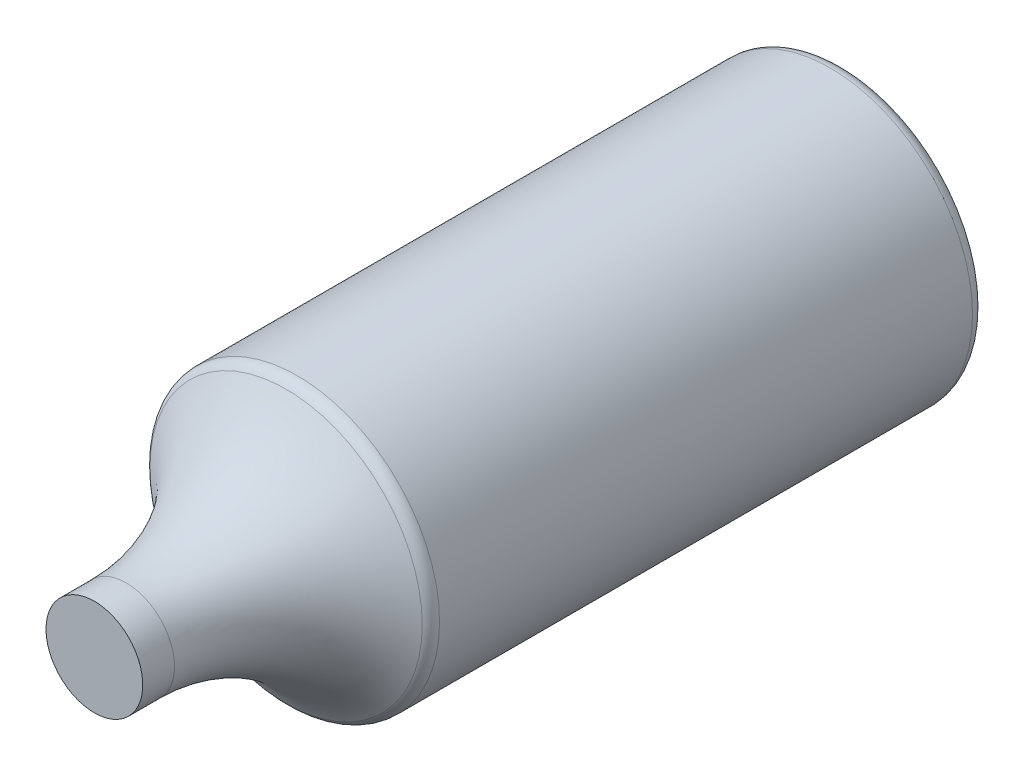
ISO-10303-21;
HEADER;
FILE_DESCRIPTION(('STEP AP214'),'2;1');
FILE_NAME('part.step','',(''),(''),'','','');
FILE_SCHEMA(('AUTOMOTIVE_DESIGN { 1 0 10303 214 1 1 1 1 }'));
ENDSEC;
DATA;
#1=APPLICATION_CONTEXT('core data for automotive mechanical design processes');
#2=APPLICATION_PROTOCOL_DEFINITION('international standard','automotive_design',2000,#1);
#3=PRODUCT_CONTEXT('',#1,'mechanical');
#4=PRODUCT('Part','Part','',(#3));
#5=PRODUCT_RELATED_PRODUCT_CATEGORY('part','',(#4));
#6=PRODUCT_DEFINITION_FORMATION('','',#4);
#7=PRODUCT_DEFINITION_CONTEXT('part definition',#1,'design');
#8=PRODUCT_DEFINITION('design','',#6,#7);
#9=PRODUCT_DEFINITION_SHAPE('','',#8);
#10=(LENGTH_UNIT() NAMED_UNIT(*) SI_UNIT(.MILLI.,.METRE.));
#11=(NAMED_UNIT(*) PLANE_ANGLE_UNIT() SI_UNIT($,.RADIAN.));
#12=(NAMED_UNIT(*) SI_UNIT($,.STERADIAN.) SOLID_ANGLE_UNIT());
#13=UNCERTAINTY_MEASURE_WITH_UNIT(LENGTH_MEASURE(1.E-05),#10,'distance_accuracy_value','');
#14=(GEOMETRIC_REPRESENTATION_CONTEXT(3) GLOBAL_UNCERTAINTY_ASSIGNED_CONTEXT((#13)) GLOBAL_UNIT_ASSIGNED_CONTEXT((#10,
#11,#12)) REPRESENTATION_CONTEXT('',''));
#15=CARTESIAN_POINT('',(0.,0.,0.));
#16=DIRECTION('',(0.,0.,1.));
#17=DIRECTION('',(1.,0.,0.));
#18=AXIS2_PLACEMENT_3D('',#15,#16,#17);
#19=CARTESIAN_POINT('',(0.,0.,-29.5));
#20=DIRECTION('',(0.,0.,1.));
#21=DIRECTION('',(-1.,0.,0.));
#22=AXIS2_PLACEMENT_3D('',#19,#20,#21);
#23=CYLINDRICAL_SURFACE('',#22,7.5);
#24=CARTESIAN_POINT('',(0.,0.,-0.699999999999999));
#25=DIRECTION('',(0.,0.,1.));
#26=DIRECTION('',(1.,0.,0.));
#27=AXIS2_PLACEMENT_3D('',#24,#25,#26);
#28=CIRCLE('',#27,7.5);
#29=CARTESIAN_POINT('',(-7.5,0.,-0.699999999999999));
#30=VERTEX_POINT('',#29);
#31=EDGE_CURVE('E52',#30,#30,#28,.T.);
#32=CARTESIAN_POINT('',(0.,0.,-28.8));
#33=DIRECTION('',(0.,0.,1.));
#34=DIRECTION('',(1.,0.,0.));
#35=AXIS2_PLACEMENT_3D('',#32,#33,#34);
#36=CIRCLE('',#35,7.5);
#37=CARTESIAN_POINT('',(-7.5,0.,-28.8));
#38=VERTEX_POINT('',#37);
#39=EDGE_CURVE('E57',#38,#38,#36,.F.);
#40=CARTESIAN_POINT('',(-7.5,0.,-0.699999999999999));
#41=CARTESIAN_POINT('',(-7.5,0.,-0.992708333333332));
#42=CARTESIAN_POINT('',(-7.5,0.,-1.28541666666667));
#43=CARTESIAN_POINT('',(-7.5,0.,-1.87083333333333));
#44=CARTESIAN_POINT('',(-7.5,0.,-2.16354166666667));
#45=CARTESIAN_POINT('',(-7.5,0.,-2.74895833333333));
#46=CARTESIAN_POINT('',(-7.5,0.,-3.04166666666667));
#47=CARTESIAN_POINT('',(-7.5,0.,-3.62708333333333));
#48=CARTESIAN_POINT('',(-7.5,0.,-3.91979166666667));
#49=CARTESIAN_POINT('',(-7.5,0.,-4.50520833333333));
#50=CARTESIAN_POINT('',(-7.5,0.,-4.79791666666667));
#51=CARTESIAN_POINT('',(-7.5,0.,-5.38333333333333));
#52=CARTESIAN_POINT('',(-7.5,0.,-5.67604166666667));
#53=CARTESIAN_POINT('',(-7.5,0.,-6.26145833333334));
#54=CARTESIAN_POINT('',(-7.5,0.,-6.55416666666667));
#55=CARTESIAN_POINT('',(-7.5,0.,-7.13958333333334));
#56=CARTESIAN_POINT('',(-7.5,0.,-7.43229166666667));
#57=CARTESIAN_POINT('',(-7.5,0.,-8.01770833333334));
#58=CARTESIAN_POINT('',(-7.5,0.,-8.31041666666667));
#59=CARTESIAN_POINT('',(-7.5,0.,-8.89583333333334));
#60=CARTESIAN_POINT('',(-7.5,0.,-9.18854166666667));
#61=CARTESIAN_POINT('',(-7.5,0.,-9.77395833333334));
#62=CARTESIAN_POINT('',(-7.5,0.,-10.0666666666667));
#63=CARTESIAN_POINT('',(-7.5,0.,-10.6520833333333));
#64=CARTESIAN_POINT('',(-7.5,0.,-10.9447916666667));
#65=CARTESIAN_POINT('',(-7.5,0.,-11.5302083333333));
#66=CARTESIAN_POINT('',(-7.5,0.,-11.8229166666667));
#67=CARTESIAN_POINT('',(-7.5,0.,-12.4083333333333));
#68=CARTESIAN_POINT('',(-7.5,0.,-12.7010416666667));
#69=CARTESIAN_POINT('',(-7.5,0.,-13.2864583333333));
#70=CARTESIAN_POINT('',(-7.5,0.,-13.5791666666667));
#71=CARTESIAN_POINT('',(-7.5,0.,-14.1645833333333));
#72=CARTESIAN_POINT('',(-7.5,0.,-14.4572916666667));
#73=CARTESIAN_POINT('',(-7.5,0.,-15.0427083333333));
#74=CARTESIAN_POINT('',(-7.5,0.,-15.3354166666667));
#75=CARTESIAN_POINT('',(-7.5,0.,-15.9208333333333));
#76=CARTESIAN_POINT('',(-7.5,0.,-16.2135416666667));
#77=CARTESIAN_POINT('',(-7.5,0.,-16.7989583333333));
#78=CARTESIAN_POINT('',(-7.5,0.,-17.0916666666667));
#79=CARTESIAN_POINT('',(-7.5,0.,-17.6770833333333));
#80=CARTESIAN_POINT('',(-7.5,0.,-17.9697916666667));
#81=CARTESIAN_POINT('',(-7.5,0.,-18.5552083333333));
#82=CARTESIAN_POINT('',(-7.5,0.,-18.8479166666667));
#83=CARTESIAN_POINT('',(-7.5,0.,-19.4333333333333));
#84=CARTESIAN_POINT('',(-7.5,0.,-19.7260416666667));
#85=CARTESIAN_POINT('',(-7.5,0.,-20.3114583333333));
#86=CARTESIAN_POINT('',(-7.5,0.,-20.6041666666667));
#87=CARTESIAN_POINT('',(-7.5,0.,-21.1895833333333));
#88=CARTESIAN_POINT('',(-7.5,0.,-21.4822916666667));
#89=CARTESIAN_POINT('',(-7.5,0.,-22.0677083333333));
#90=CARTESIAN_POINT('',(-7.5,0.,-22.3604166666667));
#91=CARTESIAN_POINT('',(-7.5,0.,-22.9458333333333));
#92=CARTESIAN_POINT('',(-7.5,0.,-23.2385416666667));
#93=CARTESIAN_POINT('',(-7.5,0.,-23.8239583333333));
#94=CARTESIAN_POINT('',(-7.5,0.,-24.1166666666667));
#95=CARTESIAN_POINT('',(-7.5,0.,-24.7020833333333));
#96=CARTESIAN_POINT('',(-7.5,0.,-24.9947916666667));
#97=CARTESIAN_POINT('',(-7.5,0.,-25.5802083333333));
#98=CARTESIAN_POINT('',(-7.5,0.,-25.8729166666667));
#99=CARTESIAN_POINT('',(-7.5,0.,-26.4583333333333));
#100=CARTESIAN_POINT('',(-7.5,0.,-26.7510416666667));
#101=CARTESIAN_POINT('',(-7.5,0.,-27.3364583333333));
#102=CARTESIAN_POINT('',(-7.5,0.,-27.6291666666667));
#103=CARTESIAN_POINT('',(-7.5,0.,-28.2145833333333));
#104=CARTESIAN_POINT('',(-7.5,0.,-28.5072916666667));
#105=CARTESIAN_POINT('',(-7.5,0.,-28.8));
#106=B_SPLINE_CURVE_WITH_KNOTS('',3,(#40,#41,#42,#43,#44,#45,#46,#47,#48,#49,#50,#51,#52,#53,
#54,#55,#56,#57,#58,#59,#60,#61,#62,#63,#64,#65,#66,#67,#68,#69,#70,#71,#72,#73,#74,#75,#76,#77,
#78,#79,#80,#81,#82,#83,#84,#85,#86,#87,#88,#89,#90,#91,#92,#93,#94,#95,#96,#97,#98,#99,#100,
#101,#102,#103,#104,#105),.UNSPECIFIED.,.F.,.F.,(4,2,2,2,2,2,2,2,2,2,2,2,2,2,2,2,2,2,2,2,2,2,2,
2,2,2,2,2,2,2,2,2,4),(0.,0.878125,1.75625,2.634375,3.5125,4.390625,5.26875,6.146875,7.025,
7.903125,8.78125,9.659375,10.5375,11.415625,12.29375,13.171875,14.05,14.928125,15.80625,
16.684375,17.5625,18.440625,19.31875,20.196875,21.075,21.953125,22.83125,23.709375,24.5875,
25.465625,26.34375,27.221875,28.1),.UNSPECIFIED.);
#107=EDGE_CURVE('BSEAM37',#30,#38,#106,.T.);
#108=ORIENTED_EDGE('',*,*,#31,.F.);
#109=ORIENTED_EDGE('',*,*,#39,.F.);
#110=ORIENTED_EDGE('',*,*,#107,.T.);
#111=ORIENTED_EDGE('',*,*,#107,.F.);
#112=EDGE_LOOP('',(#108,#110,#109,#111));
#113=FACE_BOUND('',#112,.T.);
#114=ADVANCED_FACE('F37',(#113),#23,.T.);
#115=CARTESIAN_POINT('',(0.,0.,-29.5));
#116=DIRECTION('',(0.,0.,-1.));
#117=DIRECTION('',(1.,0.,0.));
#118=AXIS2_PLACEMENT_3D('',#115,#116,#117);
#119=PLANE('',#118);
#120=CARTESIAN_POINT('',(0.,0.,-29.5));
#121=DIRECTION('',(0.,0.,1.));
#122=DIRECTION('',(1.,0.,0.));
#123=AXIS2_PLACEMENT_3D('',#120,#121,#122);
#124=CIRCLE('',#123,6.8);
#125=CARTESIAN_POINT('',(6.8,0.,-29.5));
#126=VERTEX_POINT('',#125);
#127=EDGE_CURVE('E48',#126,#126,#124,.T.);
#128=ORIENTED_EDGE('',*,*,#127,.F.);
#129=EDGE_LOOP('',(#128));
#130=FACE_BOUND('',#129,.T.);
#131=ADVANCED_FACE('F77',(#130),#119,.T.);
#132=CARTESIAN_POINT('',(0.,0.,10.));
#133=DIRECTION('',(0.,0.,-1.));
#134=DIRECTION('',(1.,0.,0.));
#135=AXIS2_PLACEMENT_3D('',#132,#133,#134);
#136=CYLINDRICAL_SURFACE('',#135,2.55);
#137=CARTESIAN_POINT('',(0.,0.,8.32371874561702));
#138=DIRECTION('',(0.,0.,-1.));
#139=DIRECTION('',(-1.,0.,0.));
#140=AXIS2_PLACEMENT_3D('',#137,#138,#139);
#141=CIRCLE('',#140,2.55);
#142=CARTESIAN_POINT('',(-2.55,0.,8.32371874561702));
#143=VERTEX_POINT('',#142);
#144=EDGE_CURVE('E44',#143,#143,#141,.T.);
#145=ORIENTED_EDGE('',*,*,#144,.F.);
#146=EDGE_LOOP('',(#145));
#147=FACE_BOUND('',#146,.T.);
#148=CARTESIAN_POINT('',(0.,0.,10.));
#149=DIRECTION('',(0.,0.,-1.));
#150=DIRECTION('',(-1.,0.,0.));
#151=AXIS2_PLACEMENT_3D('',#148,#149,#150);
#152=CIRCLE('',#151,2.55);
#153=CARTESIAN_POINT('',(-2.55,0.,10.));
#154=VERTEX_POINT('',#153);
#155=EDGE_CURVE('E60',#154,#154,#152,.T.);
#156=ORIENTED_EDGE('',*,*,#155,.T.);
#157=EDGE_LOOP('',(#156));
#158=FACE_BOUND('',#157,.T.);
#159=ADVANCED_FACE('F64',(#147,#158),#136,.T.);
#160=CARTESIAN_POINT('',(0.,0.,10.));
#161=DIRECTION('',(0.,0.,1.));
#162=DIRECTION('',(-1.,0.,0.));
#163=AXIS2_PLACEMENT_3D('',#160,#161,#162);
#164=PLANE('',#163);
#165=ORIENTED_EDGE('',*,*,#155,.F.);
#166=EDGE_LOOP('',(#165));
#167=FACE_BOUND('',#166,.T.);
#168=ADVANCED_FACE('F66',(#167),#164,.T.);
#169=CARTESIAN_POINT('',(0.,0.,-0.699999999999999));
#170=DIRECTION('',(0.,0.,-1.));
#171=DIRECTION('',(1.,0.,0.));
#172=AXIS2_PLACEMENT_3D('',#169,#170,#171);
#173=TOROIDAL_SURFACE('',#172,6.8,0.7);
#174=CARTESIAN_POINT('',(0.,0.,-0.109663259632502));
#175=DIRECTION('',(0.,0.,1.));
#176=DIRECTION('',(1.,0.,0.));
#177=AXIS2_PLACEMENT_3D('',#174,#175,#176);
#178=CIRCLE('',#177,7.17616822429909);
#179=CARTESIAN_POINT('',(7.17616822429909,0.,-0.109663259632502));
#180=VERTEX_POINT('',#179);
#181=EDGE_CURVE('E10',#180,#180,#178,.T.);
#182=ORIENTED_EDGE('',*,*,#181,.F.);
#183=EDGE_LOOP('',(#182));
#184=FACE_BOUND('',#183,.T.);
#185=ORIENTED_EDGE('',*,*,#31,.T.);
#186=EDGE_LOOP('',(#185));
#187=FACE_BOUND('',#186,.T.);
#188=ADVANCED_FACE('F68',(#184,#187),#173,.T.);
#189=CARTESIAN_POINT('',(0.,0.,-28.8));
#190=DIRECTION('',(0.,0.,-1.));
#191=DIRECTION('',(1.,0.,0.));
#192=AXIS2_PLACEMENT_3D('',#189,#190,#191);
#193=TOROIDAL_SURFACE('',#192,6.8,0.7);
#194=ORIENTED_EDGE('',*,*,#39,.T.);
#195=EDGE_LOOP('',(#194));
#196=FACE_BOUND('',#195,.T.);
#197=ORIENTED_EDGE('',*,*,#127,.T.);
#198=EDGE_LOOP('',(#197));
#199=FACE_BOUND('',#198,.T.);
#200=ADVANCED_FACE('F74',(#196,#199),#193,.T.);
#201=CARTESIAN_POINT('',(0.,0.,8.32371874561702));
#202=DIRECTION('',(0.,0.,1.));
#203=DIRECTION('',(-1.,0.,0.));
#204=AXIS2_PLACEMENT_3D('',#201,#202,#203);
#205=TOROIDAL_SURFACE('',#204,12.55,10.);
#206=ORIENTED_EDGE('',*,*,#181,.T.);
#207=EDGE_LOOP('',(#206));
#208=FACE_BOUND('',#207,.T.);
#209=ORIENTED_EDGE('',*,*,#144,.T.);
#210=EDGE_LOOP('',(#209));
#211=FACE_BOUND('',#210,.T.);
#212=ADVANCED_FACE('F39',(#208,#211),#205,.F.);
#213=CLOSED_SHELL('',(#114,#131,#159,#168,#188,#200,#212));
#214=MANIFOLD_SOLID_BREP('B2',#213);
#215=ADVANCED_BREP_SHAPE_REPRESENTATION('',(#18,#214),#14);
#216=SHAPE_DEFINITION_REPRESENTATION(#9,#215);
ENDSEC;
END-ISO-10303-21;
